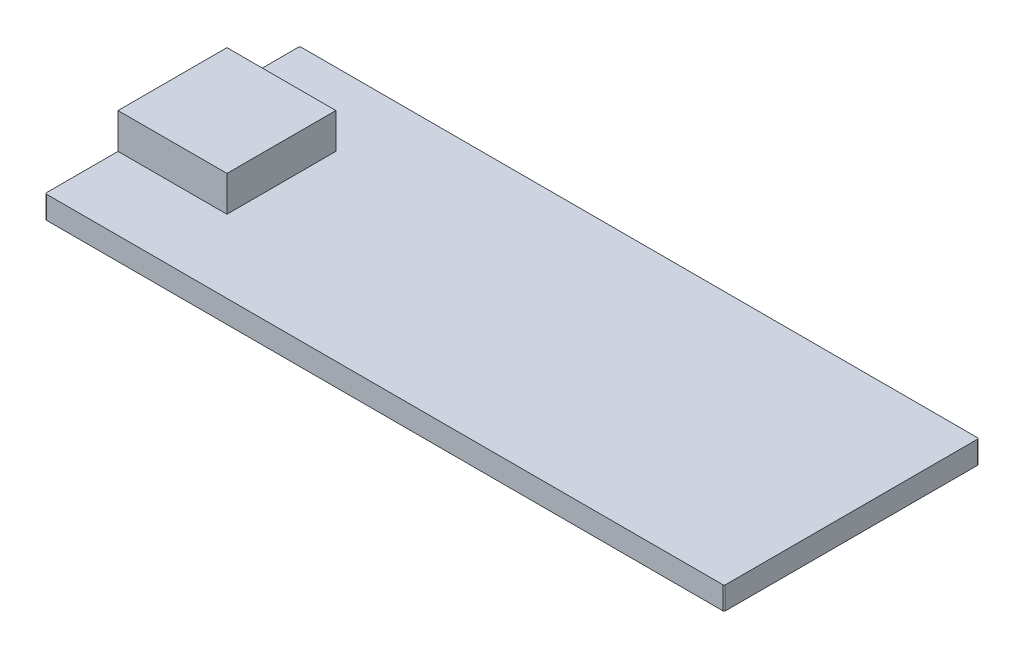
ISO-10303-21;
HEADER;
FILE_DESCRIPTION(('STEP AP214'),'2;1');
FILE_NAME('part.step','',(''),(''),'','','');
FILE_SCHEMA(('AUTOMOTIVE_DESIGN { 1 0 10303 214 1 1 1 1 }'));
ENDSEC;
DATA;
#1=APPLICATION_CONTEXT('core data for automotive mechanical design processes');
#2=APPLICATION_PROTOCOL_DEFINITION('international standard','automotive_design',2000,#1);
#3=PRODUCT_CONTEXT('',#1,'mechanical');
#4=PRODUCT('Part','Part','',(#3));
#5=PRODUCT_RELATED_PRODUCT_CATEGORY('part','',(#4));
#6=PRODUCT_DEFINITION_FORMATION('','',#4);
#7=PRODUCT_DEFINITION_CONTEXT('part definition',#1,'design');
#8=PRODUCT_DEFINITION('design','',#6,#7);
#9=PRODUCT_DEFINITION_SHAPE('','',#8);
#10=(LENGTH_UNIT() NAMED_UNIT(*) SI_UNIT(.MILLI.,.METRE.));
#11=(NAMED_UNIT(*) PLANE_ANGLE_UNIT() SI_UNIT($,.RADIAN.));
#12=(NAMED_UNIT(*) SI_UNIT($,.STERADIAN.) SOLID_ANGLE_UNIT());
#13=UNCERTAINTY_MEASURE_WITH_UNIT(LENGTH_MEASURE(1.E-05),#10,'distance_accuracy_value','');
#14=(GEOMETRIC_REPRESENTATION_CONTEXT(3) GLOBAL_UNCERTAINTY_ASSIGNED_CONTEXT((#13)) GLOBAL_UNIT_ASSIGNED_CONTEXT((#10,
#11,#12)) REPRESENTATION_CONTEXT('',''));
#15=CARTESIAN_POINT('',(0.,0.,0.));
#16=DIRECTION('',(0.,0.,1.));
#17=DIRECTION('',(1.,0.,0.));
#18=AXIS2_PLACEMENT_3D('',#15,#16,#17);
#19=CARTESIAN_POINT('',(24.,0.8,-9.));
#20=DIRECTION('',(-1.,0.,0.));
#21=DIRECTION('',(0.,0.,1.));
#22=AXIS2_PLACEMENT_3D('',#19,#20,#21);
#23=PLANE('',#22);
#24=DIRECTION('',(0.,0.,-1.));
#25=VECTOR('',#24,1.);
#26=CARTESIAN_POINT('',(24.,0.8,-9.));
#27=LINE('',#26,#25);
#28=CARTESIAN_POINT('',(24.,0.8,8.9));
#29=VERTEX_POINT('',#28);
#30=CARTESIAN_POINT('',(24.,0.8,-8.9));
#31=VERTEX_POINT('',#30);
#32=EDGE_CURVE('E154',#29,#31,#27,.T.);
#33=ORIENTED_EDGE('',*,*,#32,.F.);
#34=DIRECTION('',(0.,-1.,0.));
#35=VECTOR('',#34,1.);
#36=CARTESIAN_POINT('',(24.,0.8,8.9));
#37=LINE('',#36,#35);
#38=CARTESIAN_POINT('',(24.,-0.8,8.9));
#39=VERTEX_POINT('',#38);
#40=EDGE_CURVE('E176',#29,#39,#37,.T.);
#41=ORIENTED_EDGE('',*,*,#40,.T.);
#42=DIRECTION('',(0.,0.,-1.));
#43=VECTOR('',#42,1.);
#44=CARTESIAN_POINT('',(24.,-0.8,-9.));
#45=LINE('',#44,#43);
#46=CARTESIAN_POINT('',(24.,-0.8,-8.9));
#47=VERTEX_POINT('',#46);
#48=EDGE_CURVE('E145',#39,#47,#45,.T.);
#49=ORIENTED_EDGE('',*,*,#48,.T.);
#50=DIRECTION('',(0.,-1.,0.));
#51=VECTOR('',#50,1.);
#52=CARTESIAN_POINT('',(24.,0.8,-8.9));
#53=LINE('',#52,#51);
#54=EDGE_CURVE('E166',#47,#31,#53,.F.);
#55=ORIENTED_EDGE('',*,*,#54,.T.);
#56=EDGE_LOOP('',(#33,#41,#49,#55));
#57=FACE_BOUND('',#56,.T.);
#58=ADVANCED_FACE('F36',(#57),#23,.F.);
#59=CARTESIAN_POINT('',(-24.,0.8,-9.));
#60=DIRECTION('',(0.,0.,1.));
#61=DIRECTION('',(1.,0.,0.));
#62=AXIS2_PLACEMENT_3D('',#59,#60,#61);
#63=PLANE('',#62);
#64=DIRECTION('',(-1.,0.,0.));
#65=VECTOR('',#64,1.);
#66=CARTESIAN_POINT('',(-24.,0.8,-9.));
#67=LINE('',#66,#65);
#68=CARTESIAN_POINT('',(23.9,0.8,-9.));
#69=VERTEX_POINT('',#68);
#70=CARTESIAN_POINT('',(-23.9,0.8,-9.));
#71=VERTEX_POINT('',#70);
#72=EDGE_CURVE('E157',#69,#71,#67,.T.);
#73=ORIENTED_EDGE('',*,*,#72,.F.);
#74=DIRECTION('',(0.,-1.,0.));
#75=VECTOR('',#74,1.);
#76=CARTESIAN_POINT('',(23.9,0.8,-9.));
#77=LINE('',#76,#75);
#78=CARTESIAN_POINT('',(23.9,-0.8,-9.));
#79=VERTEX_POINT('',#78);
#80=EDGE_CURVE('E202',#69,#79,#77,.T.);
#81=ORIENTED_EDGE('',*,*,#80,.T.);
#82=DIRECTION('',(-1.,0.,0.));
#83=VECTOR('',#82,1.);
#84=CARTESIAN_POINT('',(-24.,-0.8,-9.));
#85=LINE('',#84,#83);
#86=CARTESIAN_POINT('',(-23.9,-0.8,-9.));
#87=VERTEX_POINT('',#86);
#88=EDGE_CURVE('E148',#79,#87,#85,.T.);
#89=ORIENTED_EDGE('',*,*,#88,.T.);
#90=DIRECTION('',(0.,-1.,0.));
#91=VECTOR('',#90,1.);
#92=CARTESIAN_POINT('',(-23.9,0.8,-9.));
#93=LINE('',#92,#91);
#94=EDGE_CURVE('E200',#87,#71,#93,.F.);
#95=ORIENTED_EDGE('',*,*,#94,.T.);
#96=EDGE_LOOP('',(#73,#81,#89,#95));
#97=FACE_BOUND('',#96,.T.);
#98=ADVANCED_FACE('F237',(#97),#63,.F.);
#99=CARTESIAN_POINT('',(-24.,0.8,-9.));
#100=DIRECTION('',(1.,0.,0.));
#101=DIRECTION('',(0.,0.,-1.));
#102=AXIS2_PLACEMENT_3D('',#99,#100,#101);
#103=PLANE('',#102);
#104=DIRECTION('',(0.,0.,1.));
#105=VECTOR('',#104,1.);
#106=CARTESIAN_POINT('',(-24.,0.8,-9.));
#107=LINE('',#106,#105);
#108=CARTESIAN_POINT('',(-24.,0.8,-8.9));
#109=VERTEX_POINT('',#108);
#110=CARTESIAN_POINT('',(-24.,0.8,-3.85));
#111=VERTEX_POINT('',#110);
#112=EDGE_CURVE('E162',#109,#111,#107,.T.);
#113=ORIENTED_EDGE('',*,*,#112,.F.);
#114=DIRECTION('',(0.,-1.,0.));
#115=VECTOR('',#114,1.);
#116=CARTESIAN_POINT('',(-24.,0.8,-8.9));
#117=LINE('',#116,#115);
#118=CARTESIAN_POINT('',(-24.,-0.8,-8.9));
#119=VERTEX_POINT('',#118);
#120=EDGE_CURVE('E11',#109,#119,#117,.T.);
#121=ORIENTED_EDGE('',*,*,#120,.T.);
#122=DIRECTION('',(0.,0.,1.));
#123=VECTOR('',#122,1.);
#124=CARTESIAN_POINT('',(-24.,-0.8,-9.));
#125=LINE('',#124,#123);
#126=CARTESIAN_POINT('',(-24.,-0.8,8.9));
#127=VERTEX_POINT('',#126);
#128=EDGE_CURVE('E170',#119,#127,#125,.T.);
#129=ORIENTED_EDGE('',*,*,#128,.T.);
#130=DIRECTION('',(0.,-1.,0.));
#131=VECTOR('',#130,1.);
#132=CARTESIAN_POINT('',(-24.,0.8,8.9));
#133=LINE('',#132,#131);
#134=CARTESIAN_POINT('',(-24.,0.8,8.9));
#135=VERTEX_POINT('',#134);
#136=EDGE_CURVE('E44',#127,#135,#133,.F.);
#137=ORIENTED_EDGE('',*,*,#136,.T.);
#138=CARTESIAN_POINT('',(-24.,0.8,3.85));
#139=VERTEX_POINT('',#138);
#140=EDGE_CURVE('E161',#139,#135,#107,.T.);
#141=ORIENTED_EDGE('',*,*,#140,.F.);
#142=DIRECTION('',(0.,-1.,0.));
#143=VECTOR('',#142,1.);
#144=CARTESIAN_POINT('',(-24.,3.3,3.85));
#145=LINE('',#144,#143);
#146=CARTESIAN_POINT('',(-24.,3.3,3.85));
#147=VERTEX_POINT('',#146);
#148=EDGE_CURVE('E150',#147,#139,#145,.T.);
#149=ORIENTED_EDGE('',*,*,#148,.F.);
#150=DIRECTION('',(0.,0.,1.));
#151=VECTOR('',#150,1.);
#152=CARTESIAN_POINT('',(-24.,3.3,-3.85));
#153=LINE('',#152,#151);
#154=CARTESIAN_POINT('',(-24.,3.3,-3.85));
#155=VERTEX_POINT('',#154);
#156=EDGE_CURVE('E132',#155,#147,#153,.T.);
#157=ORIENTED_EDGE('',*,*,#156,.F.);
#158=DIRECTION('',(0.,-1.,0.));
#159=VECTOR('',#158,1.);
#160=CARTESIAN_POINT('',(-24.,3.3,-3.85));
#161=LINE('',#160,#159);
#162=EDGE_CURVE('E129',#155,#111,#161,.T.);
#163=ORIENTED_EDGE('',*,*,#162,.T.);
#164=EDGE_LOOP('',(#113,#121,#129,#137,#141,#149,#157,#163));
#165=FACE_BOUND('',#164,.T.);
#166=ADVANCED_FACE('F210',(#165),#103,.F.);
#167=CARTESIAN_POINT('',(-24.,0.8,9.));
#168=DIRECTION('',(0.,0.,-1.));
#169=DIRECTION('',(-1.,0.,0.));
#170=AXIS2_PLACEMENT_3D('',#167,#168,#169);
#171=PLANE('',#170);
#172=DIRECTION('',(1.,0.,0.));
#173=VECTOR('',#172,1.);
#174=CARTESIAN_POINT('',(-24.,-0.8,9.));
#175=LINE('',#174,#173);
#176=CARTESIAN_POINT('',(-23.9,-0.8,9.));
#177=VERTEX_POINT('',#176);
#178=CARTESIAN_POINT('',(23.9,-0.8,9.));
#179=VERTEX_POINT('',#178);
#180=EDGE_CURVE('E158',#177,#179,#175,.T.);
#181=ORIENTED_EDGE('',*,*,#180,.T.);
#182=DIRECTION('',(0.,-1.,0.));
#183=VECTOR('',#182,1.);
#184=CARTESIAN_POINT('',(23.9,0.8,9.));
#185=LINE('',#184,#183);
#186=CARTESIAN_POINT('',(23.9,0.8,9.));
#187=VERTEX_POINT('',#186);
#188=EDGE_CURVE('E190',#179,#187,#185,.F.);
#189=ORIENTED_EDGE('',*,*,#188,.T.);
#190=DIRECTION('',(1.,0.,0.));
#191=VECTOR('',#190,1.);
#192=CARTESIAN_POINT('',(-24.,0.8,9.));
#193=LINE('',#192,#191);
#194=CARTESIAN_POINT('',(-23.9,0.8,9.));
#195=VERTEX_POINT('',#194);
#196=EDGE_CURVE('E164',#195,#187,#193,.T.);
#197=ORIENTED_EDGE('',*,*,#196,.F.);
#198=DIRECTION('',(0.,-1.,0.));
#199=VECTOR('',#198,1.);
#200=CARTESIAN_POINT('',(-23.9,0.8,9.));
#201=LINE('',#200,#199);
#202=EDGE_CURVE('E187',#195,#177,#201,.T.);
#203=ORIENTED_EDGE('',*,*,#202,.T.);
#204=EDGE_LOOP('',(#181,#189,#197,#203));
#205=FACE_BOUND('',#204,.T.);
#206=ADVANCED_FACE('F220',(#205),#171,.F.);
#207=CARTESIAN_POINT('',(0.,0.8,0.));
#208=DIRECTION('',(0.,1.,0.));
#209=DIRECTION('',(0.,0.,1.));
#210=AXIS2_PLACEMENT_3D('',#207,#208,#209);
#211=PLANE('',#210);
#212=DIRECTION('',(1.,0.,0.));
#213=VECTOR('',#212,1.);
#214=CARTESIAN_POINT('',(-24.,0.8,3.85));
#215=LINE('',#214,#213);
#216=CARTESIAN_POINT('',(-16.3,0.8,3.85));
#217=VERTEX_POINT('',#216);
#218=EDGE_CURVE('E142',#139,#217,#215,.T.);
#219=ORIENTED_EDGE('',*,*,#218,.F.);
#220=ORIENTED_EDGE('',*,*,#140,.T.);
#221=CARTESIAN_POINT('',(-23.9,0.8,8.9));
#222=DIRECTION('',(0.,1.,0.));
#223=DIRECTION('',(0.,0.,1.));
#224=AXIS2_PLACEMENT_3D('',#221,#222,#223);
#225=CIRCLE('',#224,0.1);
#226=EDGE_CURVE('E192',#135,#195,#225,.T.);
#227=ORIENTED_EDGE('',*,*,#226,.T.);
#228=ORIENTED_EDGE('',*,*,#196,.T.);
#229=CARTESIAN_POINT('',(23.9,0.8,8.9));
#230=DIRECTION('',(0.,1.,0.));
#231=DIRECTION('',(0.,0.,1.));
#232=AXIS2_PLACEMENT_3D('',#229,#230,#231);
#233=CIRCLE('',#232,0.1);
#234=EDGE_CURVE('E198',#187,#29,#233,.T.);
#235=ORIENTED_EDGE('',*,*,#234,.T.);
#236=ORIENTED_EDGE('',*,*,#32,.T.);
#237=CARTESIAN_POINT('',(23.9,0.8,-8.9));
#238=DIRECTION('',(0.,1.,0.));
#239=DIRECTION('',(0.,0.,1.));
#240=AXIS2_PLACEMENT_3D('',#237,#238,#239);
#241=CIRCLE('',#240,0.1);
#242=EDGE_CURVE('E196',#31,#69,#241,.T.);
#243=ORIENTED_EDGE('',*,*,#242,.T.);
#244=ORIENTED_EDGE('',*,*,#72,.T.);
#245=CARTESIAN_POINT('',(-23.9,0.8,-8.9));
#246=DIRECTION('',(0.,1.,0.));
#247=DIRECTION('',(0.,0.,1.));
#248=AXIS2_PLACEMENT_3D('',#245,#246,#247);
#249=CIRCLE('',#248,0.1);
#250=EDGE_CURVE('E194',#71,#109,#249,.T.);
#251=ORIENTED_EDGE('',*,*,#250,.T.);
#252=ORIENTED_EDGE('',*,*,#112,.T.);
#253=DIRECTION('',(-1.,0.,0.));
#254=VECTOR('',#253,1.);
#255=CARTESIAN_POINT('',(-24.,0.8,-3.85));
#256=LINE('',#255,#254);
#257=CARTESIAN_POINT('',(-16.3,0.8,-3.85));
#258=VERTEX_POINT('',#257);
#259=EDGE_CURVE('E56',#258,#111,#256,.T.);
#260=ORIENTED_EDGE('',*,*,#259,.F.);
#261=DIRECTION('',(0.,0.,-1.));
#262=VECTOR('',#261,1.);
#263=CARTESIAN_POINT('',(-16.3,0.8,-3.85));
#264=LINE('',#263,#262);
#265=EDGE_CURVE('E51',#217,#258,#264,.T.);
#266=ORIENTED_EDGE('',*,*,#265,.F.);
#267=EDGE_LOOP('',(#219,#220,#227,#228,#235,#236,#243,#244,#251,#252,#260,#266));
#268=FACE_BOUND('',#267,.T.);
#269=ADVANCED_FACE('F217',(#268),#211,.T.);
#270=CARTESIAN_POINT('',(0.,-0.8,0.));
#271=DIRECTION('',(0.,1.,0.));
#272=DIRECTION('',(0.,0.,1.));
#273=AXIS2_PLACEMENT_3D('',#270,#271,#272);
#274=PLANE('',#273);
#275=ORIENTED_EDGE('',*,*,#48,.F.);
#276=CARTESIAN_POINT('',(23.9,-0.8,8.9));
#277=DIRECTION('',(0.,1.,0.));
#278=DIRECTION('',(0.,0.,1.));
#279=AXIS2_PLACEMENT_3D('',#276,#277,#278);
#280=CIRCLE('',#279,0.1);
#281=EDGE_CURVE('E185',#39,#179,#280,.F.);
#282=ORIENTED_EDGE('',*,*,#281,.T.);
#283=ORIENTED_EDGE('',*,*,#180,.F.);
#284=CARTESIAN_POINT('',(-23.9,-0.8,8.9));
#285=DIRECTION('',(0.,1.,0.));
#286=DIRECTION('',(0.,0.,1.));
#287=AXIS2_PLACEMENT_3D('',#284,#285,#286);
#288=CIRCLE('',#287,0.1);
#289=EDGE_CURVE('E179',#177,#127,#288,.F.);
#290=ORIENTED_EDGE('',*,*,#289,.T.);
#291=ORIENTED_EDGE('',*,*,#128,.F.);
#292=CARTESIAN_POINT('',(-23.9,-0.8,-8.9));
#293=DIRECTION('',(0.,1.,0.));
#294=DIRECTION('',(0.,0.,1.));
#295=AXIS2_PLACEMENT_3D('',#292,#293,#294);
#296=CIRCLE('',#295,0.1);
#297=EDGE_CURVE('E181',#119,#87,#296,.F.);
#298=ORIENTED_EDGE('',*,*,#297,.T.);
#299=ORIENTED_EDGE('',*,*,#88,.F.);
#300=CARTESIAN_POINT('',(23.9,-0.8,-8.9));
#301=DIRECTION('',(0.,1.,0.));
#302=DIRECTION('',(0.,0.,1.));
#303=AXIS2_PLACEMENT_3D('',#300,#301,#302);
#304=CIRCLE('',#303,0.1);
#305=EDGE_CURVE('E183',#79,#47,#304,.F.);
#306=ORIENTED_EDGE('',*,*,#305,.T.);
#307=EDGE_LOOP('',(#275,#282,#283,#290,#291,#298,#299,#306));
#308=FACE_BOUND('',#307,.T.);
#309=ADVANCED_FACE('F270',(#308),#274,.F.);
#310=CARTESIAN_POINT('',(23.9,0.8,8.9));
#311=DIRECTION('',(0.,-1.,0.));
#312=DIRECTION('',(0.,0.,-1.));
#313=AXIS2_PLACEMENT_3D('',#310,#311,#312);
#314=CYLINDRICAL_SURFACE('',#313,0.1);
#315=ORIENTED_EDGE('',*,*,#234,.F.);
#316=ORIENTED_EDGE('',*,*,#188,.F.);
#317=ORIENTED_EDGE('',*,*,#281,.F.);
#318=ORIENTED_EDGE('',*,*,#40,.F.);
#319=EDGE_LOOP('',(#315,#316,#317,#318));
#320=FACE_BOUND('',#319,.T.);
#321=ADVANCED_FACE('F224',(#320),#314,.T.);
#322=CARTESIAN_POINT('',(23.9,0.8,-8.9));
#323=DIRECTION('',(0.,-1.,0.));
#324=DIRECTION('',(0.,0.,-1.));
#325=AXIS2_PLACEMENT_3D('',#322,#323,#324);
#326=CYLINDRICAL_SURFACE('',#325,0.1);
#327=ORIENTED_EDGE('',*,*,#242,.F.);
#328=ORIENTED_EDGE('',*,*,#54,.F.);
#329=ORIENTED_EDGE('',*,*,#305,.F.);
#330=ORIENTED_EDGE('',*,*,#80,.F.);
#331=EDGE_LOOP('',(#327,#328,#329,#330));
#332=FACE_BOUND('',#331,.T.);
#333=ADVANCED_FACE('F232',(#332),#326,.T.);
#334=CARTESIAN_POINT('',(-23.9,0.8,-8.9));
#335=DIRECTION('',(0.,-1.,0.));
#336=DIRECTION('',(0.,0.,-1.));
#337=AXIS2_PLACEMENT_3D('',#334,#335,#336);
#338=CYLINDRICAL_SURFACE('',#337,0.1);
#339=ORIENTED_EDGE('',*,*,#250,.F.);
#340=ORIENTED_EDGE('',*,*,#94,.F.);
#341=ORIENTED_EDGE('',*,*,#297,.F.);
#342=ORIENTED_EDGE('',*,*,#120,.F.);
#343=EDGE_LOOP('',(#339,#340,#341,#342));
#344=FACE_BOUND('',#343,.T.);
#345=ADVANCED_FACE('F241',(#344),#338,.T.);
#346=CARTESIAN_POINT('',(-23.9,0.8,8.9));
#347=DIRECTION('',(0.,-1.,0.));
#348=DIRECTION('',(0.,0.,-1.));
#349=AXIS2_PLACEMENT_3D('',#346,#347,#348);
#350=CYLINDRICAL_SURFACE('',#349,0.1);
#351=ORIENTED_EDGE('',*,*,#226,.F.);
#352=ORIENTED_EDGE('',*,*,#136,.F.);
#353=ORIENTED_EDGE('',*,*,#289,.F.);
#354=ORIENTED_EDGE('',*,*,#202,.F.);
#355=EDGE_LOOP('',(#351,#352,#353,#354));
#356=FACE_BOUND('',#355,.T.);
#357=ADVANCED_FACE('F38',(#356),#350,.T.);
#358=CARTESIAN_POINT('',(-16.3,3.3,-3.85));
#359=DIRECTION('',(-1.,0.,0.));
#360=DIRECTION('',(0.,0.,1.));
#361=AXIS2_PLACEMENT_3D('',#358,#359,#360);
#362=PLANE('',#361);
#363=ORIENTED_EDGE('',*,*,#265,.T.);
#364=DIRECTION('',(0.,-1.,0.));
#365=VECTOR('',#364,1.);
#366=CARTESIAN_POINT('',(-16.3,3.3,-3.85));
#367=LINE('',#366,#365);
#368=CARTESIAN_POINT('',(-16.3,3.3,-3.85));
#369=VERTEX_POINT('',#368);
#370=EDGE_CURVE('E127',#369,#258,#367,.T.);
#371=ORIENTED_EDGE('',*,*,#370,.F.);
#372=DIRECTION('',(0.,0.,-1.));
#373=VECTOR('',#372,1.);
#374=CARTESIAN_POINT('',(-16.3,3.3,-3.85));
#375=LINE('',#374,#373);
#376=CARTESIAN_POINT('',(-16.3,3.3,3.85));
#377=VERTEX_POINT('',#376);
#378=EDGE_CURVE('E133',#377,#369,#375,.T.);
#379=ORIENTED_EDGE('',*,*,#378,.F.);
#380=DIRECTION('',(0.,-1.,0.));
#381=VECTOR('',#380,1.);
#382=CARTESIAN_POINT('',(-16.3,3.3,3.85));
#383=LINE('',#382,#381);
#384=EDGE_CURVE('E244',#377,#217,#383,.T.);
#385=ORIENTED_EDGE('',*,*,#384,.T.);
#386=EDGE_LOOP('',(#363,#371,#379,#385));
#387=FACE_BOUND('',#386,.T.);
#388=ADVANCED_FACE('F144',(#387),#362,.F.);
#389=CARTESIAN_POINT('',(-24.,3.3,-3.85));
#390=DIRECTION('',(0.,0.,1.));
#391=DIRECTION('',(1.,0.,0.));
#392=AXIS2_PLACEMENT_3D('',#389,#390,#391);
#393=PLANE('',#392);
#394=ORIENTED_EDGE('',*,*,#259,.T.);
#395=ORIENTED_EDGE('',*,*,#162,.F.);
#396=DIRECTION('',(-1.,0.,0.));
#397=VECTOR('',#396,1.);
#398=CARTESIAN_POINT('',(-24.,3.3,-3.85));
#399=LINE('',#398,#397);
#400=EDGE_CURVE('E123',#369,#155,#399,.T.);
#401=ORIENTED_EDGE('',*,*,#400,.F.);
#402=ORIENTED_EDGE('',*,*,#370,.T.);
#403=EDGE_LOOP('',(#394,#395,#401,#402));
#404=FACE_BOUND('',#403,.T.);
#405=ADVANCED_FACE('F125',(#404),#393,.F.);
#406=CARTESIAN_POINT('',(-24.,3.3,3.85));
#407=DIRECTION('',(0.,0.,-1.));
#408=DIRECTION('',(-1.,0.,0.));
#409=AXIS2_PLACEMENT_3D('',#406,#407,#408);
#410=PLANE('',#409);
#411=ORIENTED_EDGE('',*,*,#218,.T.);
#412=ORIENTED_EDGE('',*,*,#384,.F.);
#413=DIRECTION('',(1.,0.,0.));
#414=VECTOR('',#413,1.);
#415=CARTESIAN_POINT('',(-24.,3.3,3.85));
#416=LINE('',#415,#414);
#417=EDGE_CURVE('E138',#147,#377,#416,.T.);
#418=ORIENTED_EDGE('',*,*,#417,.F.);
#419=ORIENTED_EDGE('',*,*,#148,.T.);
#420=EDGE_LOOP('',(#411,#412,#418,#419));
#421=FACE_BOUND('',#420,.T.);
#422=ADVANCED_FACE('F251',(#421),#410,.F.);
#423=CARTESIAN_POINT('',(0.,3.3,0.));
#424=DIRECTION('',(0.,1.,0.));
#425=DIRECTION('',(0.,0.,1.));
#426=AXIS2_PLACEMENT_3D('',#423,#424,#425);
#427=PLANE('',#426);
#428=ORIENTED_EDGE('',*,*,#378,.T.);
#429=ORIENTED_EDGE('',*,*,#400,.T.);
#430=ORIENTED_EDGE('',*,*,#156,.T.);
#431=ORIENTED_EDGE('',*,*,#417,.T.);
#432=EDGE_LOOP('',(#428,#429,#430,#431));
#433=FACE_BOUND('',#432,.T.);
#434=ADVANCED_FACE('F136',(#433),#427,.T.);
#435=CLOSED_SHELL('',(#58,#98,#166,#206,#269,#309,#321,#333,#345,#357,#388,#405,#422,#434));
#436=MANIFOLD_SOLID_BREP('B2',#435);
#437=ADVANCED_BREP_SHAPE_REPRESENTATION('',(#18,#436),#14);
#438=SHAPE_DEFINITION_REPRESENTATION(#9,#437);
ENDSEC;
END-ISO-10303-21;
